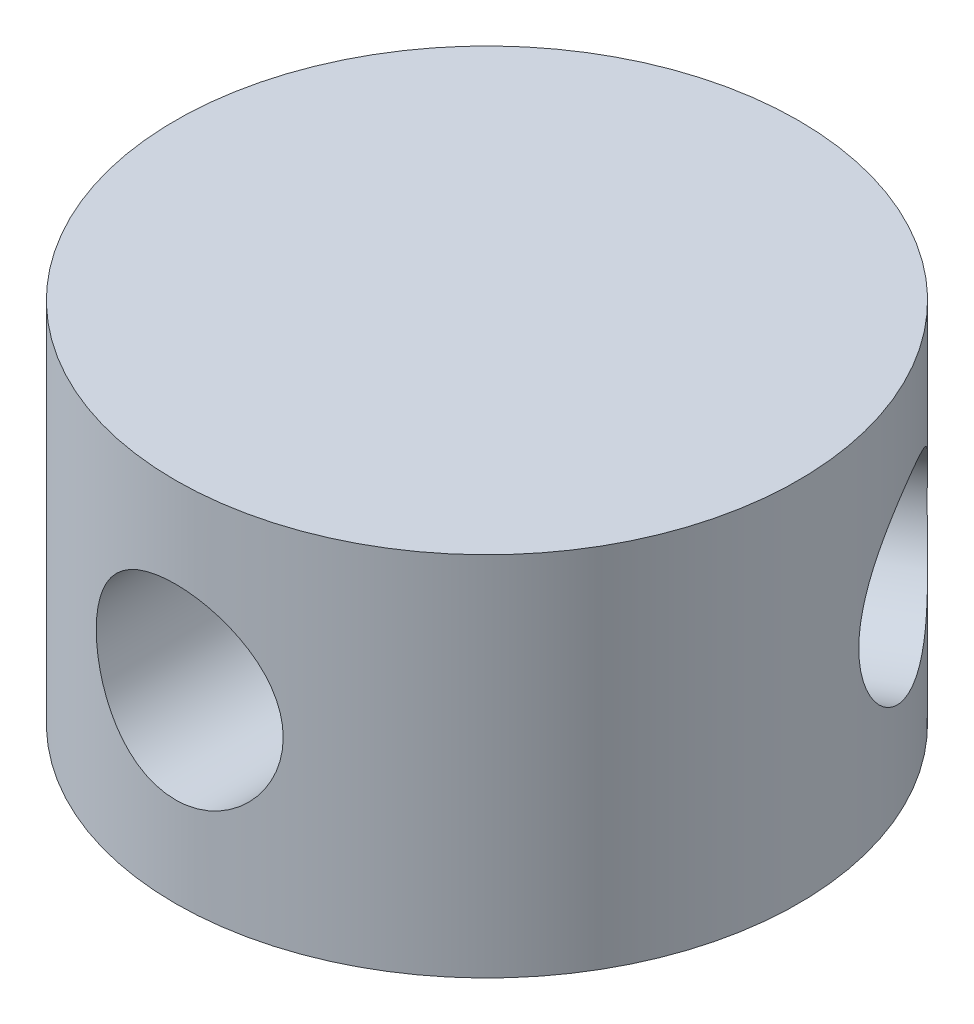
ISO-10303-21;
HEADER;
FILE_DESCRIPTION(('STEP AP214'),'2;1');
FILE_NAME('part.step','',(''),(''),'','','');
FILE_SCHEMA(('AUTOMOTIVE_DESIGN { 1 0 10303 214 1 1 1 1 }'));
ENDSEC;
DATA;
#1=APPLICATION_CONTEXT('core data for automotive mechanical design processes');
#2=APPLICATION_PROTOCOL_DEFINITION('international standard','automotive_design',2000,#1);
#3=PRODUCT_CONTEXT('',#1,'mechanical');
#4=PRODUCT('Part','Part','',(#3));
#5=PRODUCT_RELATED_PRODUCT_CATEGORY('part','',(#4));
#6=PRODUCT_DEFINITION_FORMATION('','',#4);
#7=PRODUCT_DEFINITION_CONTEXT('part definition',#1,'design');
#8=PRODUCT_DEFINITION('design','',#6,#7);
#9=PRODUCT_DEFINITION_SHAPE('','',#8);
#10=(LENGTH_UNIT() NAMED_UNIT(*) SI_UNIT(.MILLI.,.METRE.));
#11=(NAMED_UNIT(*) PLANE_ANGLE_UNIT() SI_UNIT($,.RADIAN.));
#12=(NAMED_UNIT(*) SI_UNIT($,.STERADIAN.) SOLID_ANGLE_UNIT());
#13=UNCERTAINTY_MEASURE_WITH_UNIT(LENGTH_MEASURE(1.E-05),#10,'distance_accuracy_value','');
#14=(GEOMETRIC_REPRESENTATION_CONTEXT(3) GLOBAL_UNCERTAINTY_ASSIGNED_CONTEXT((#13)) GLOBAL_UNIT_ASSIGNED_CONTEXT((#10,
#11,#12)) REPRESENTATION_CONTEXT('',''));
#15=CARTESIAN_POINT('',(0.,0.,0.));
#16=DIRECTION('',(0.,0.,1.));
#17=DIRECTION('',(1.,0.,0.));
#18=AXIS2_PLACEMENT_3D('',#15,#16,#17);
#19=CARTESIAN_POINT('',(0.,20.,0.));
#20=DIRECTION('',(0.,-1.,0.));
#21=DIRECTION('',(0.,0.,-1.));
#22=AXIS2_PLACEMENT_3D('',#19,#20,#21);
#23=CYLINDRICAL_SURFACE('',#22,17.);
#24=CARTESIAN_POINT('',(11.4943048955795,10.,-12.5252127713447));
#25=CARTESIAN_POINT('',(11.4943091391889,9.72053853699297,-12.5252112025164));
#26=CARTESIAN_POINT('',(11.5121535043202,9.44104263790955,-12.5089037602181));
#27=CARTESIAN_POINT('',(11.582323652573,8.89022215138816,-12.4439542886179));
#28=CARTESIAN_POINT('',(11.6346609568794,8.61890032589522,-12.3953014553984));
#29=CARTESIAN_POINT('',(11.7703119951408,8.09248192387591,-12.266556572506));
#30=CARTESIAN_POINT('',(11.8535742009086,7.83735917924745,-12.1865168085596));
#31=CARTESIAN_POINT('',(12.046230903556,7.34928542441603,-11.996107448568));
#32=CARTESIAN_POINT('',(12.1556293122564,7.11633774047292,-11.8857333119874));
#33=CARTESIAN_POINT('',(12.3983275906579,6.67185427203691,-11.6324133127298));
#34=CARTESIAN_POINT('',(12.5322228461527,6.46112394698262,-11.4886242638794));
#35=CARTESIAN_POINT('',(12.815100635476,6.07423096550347,-11.1722052069468));
#36=CARTESIAN_POINT('',(12.9640851049248,5.89807275247041,-10.9995714968672));
#37=CARTESIAN_POINT('',(13.2735846955966,5.58182682056676,-10.6241355000564));
#38=CARTESIAN_POINT('',(13.4342745533065,5.44256035689445,-10.4207831661269));
#39=CARTESIAN_POINT('',(13.757182796132,5.20944331925463,-9.99060207069339));
#40=CARTESIAN_POINT('',(13.9194008438892,5.11558295048468,-9.7637783851526));
#41=CARTESIAN_POINT('',(14.2339950457867,4.97860799629227,-9.29891731425782));
#42=CARTESIAN_POINT('',(14.3865199937958,4.93411856598081,-9.06138632775509));
#43=CARTESIAN_POINT('',(14.6810757235563,4.89280109620211,-8.57592863912629));
#44=CARTESIAN_POINT('',(14.8231087031818,4.89596304603335,-8.32800413140644));
#45=CARTESIAN_POINT('',(15.0881298736171,4.94893575304626,-7.83732552729773));
#46=CARTESIAN_POINT('',(15.2115805337236,4.99725765895348,-7.59465822612114));
#47=CARTESIAN_POINT('',(15.4422263749425,5.13674654238066,-7.11398284027728));
#48=CARTESIAN_POINT('',(15.5494205260546,5.22791623320535,-6.87597505166461));
#49=CARTESIAN_POINT('',(15.7476518826786,5.45152087962283,-6.40910186640061));
#50=CARTESIAN_POINT('',(15.8384863646027,5.58442408954371,-6.18037523951549));
#51=CARTESIAN_POINT('',(16.0026345620649,5.88735269825698,-5.74199944763631));
#52=CARTESIAN_POINT('',(16.075944112242,6.0573869040796,-5.53235482540923));
#53=CARTESIAN_POINT('',(16.2085898798231,6.43747235255154,-5.13108424221061));
#54=CARTESIAN_POINT('',(16.2672785082069,6.64881352468632,-4.94046440445144));
#55=CARTESIAN_POINT('',(16.3685948428311,7.10153406084096,-4.5936727163767));
#56=CARTESIAN_POINT('',(16.4112209532096,7.34291640637865,-4.43750428955632));
#57=CARTESIAN_POINT('',(16.4826112226964,7.85201419540269,-4.16457733711507));
#58=CARTESIAN_POINT('',(16.5112385376736,8.11995995574973,-4.04821107964877));
#59=CARTESIAN_POINT('',(16.5556782401713,8.67266450852361,-3.86247882302972));
#60=CARTESIAN_POINT('',(16.5714948085423,8.95741778315959,-3.79309749132657));
#61=CARTESIAN_POINT('',(16.5910583743358,9.52428002655414,-3.70657371426142));
#62=CARTESIAN_POINT('',(16.59523326391,9.8060919612504,-3.68758057334801));
#63=CARTESIAN_POINT('',(16.5930351099663,10.3688078600227,-3.69746122350779));
#64=CARTESIAN_POINT('',(16.5866635429618,10.649711945682,-3.72632831410652));
#65=CARTESIAN_POINT('',(16.5632399278289,11.1950604851038,-3.82906088886021));
#66=CARTESIAN_POINT('',(16.5464696445532,11.4597429584967,-3.90173789226828));
#67=CARTESIAN_POINT('',(16.5014964165414,11.97336574877,-4.08775140933676));
#68=CARTESIAN_POINT('',(16.4732917065157,12.2223036280777,-4.20109420082303));
#69=CARTESIAN_POINT('',(16.403105234614,12.7047593778455,-4.46738511332275));
#70=CARTESIAN_POINT('',(16.3607740180636,12.9376840513517,-4.62131458230898));
#71=CARTESIAN_POINT('',(16.2608526581479,13.3749695610147,-4.96145500568997));
#72=CARTESIAN_POINT('',(16.2032588611629,13.5793235398835,-5.147673685915));
#73=CARTESIAN_POINT('',(16.0687310107979,13.9616133797701,-5.55366855741561));
#74=CARTESIAN_POINT('',(15.991149080423,14.1382611385557,-5.77444598558341));
#75=CARTESIAN_POINT('',(15.8166685958073,14.4504867834944,-6.23649630449087));
#76=CARTESIAN_POINT('',(15.7197710012639,14.586066709257,-6.47776817662381));
#77=CARTESIAN_POINT('',(15.5073858628341,14.8110001039322,-6.97082578529305));
#78=CARTESIAN_POINT('',(15.3920460137217,14.9006988549405,-7.22251710469358));
#79=CARTESIAN_POINT('',(15.1437121781149,15.0322071242274,-7.72965570488983));
#80=CARTESIAN_POINT('',(15.0107232548554,15.0740303442246,-7.98510188985502));
#81=CARTESIAN_POINT('',(14.7356999073447,15.1075583497853,-8.48154407292581));
#82=CARTESIAN_POINT('',(14.5942110476232,15.1011311643867,-8.72271771670226));
#83=CARTESIAN_POINT('',(14.3021457670378,15.0428064495029,-9.19377085785793));
#84=CARTESIAN_POINT('',(14.1515698618854,14.9909114981663,-9.42365099482983));
#85=CARTESIAN_POINT('',(13.8483022354747,14.8442803512415,-9.8638363779501));
#86=CARTESIAN_POINT('',(13.6956505980359,14.7500101857942,-10.0743253187337));
#87=CARTESIAN_POINT('',(13.392374428475,14.5217214906747,-10.4741271825936));
#88=CARTESIAN_POINT('',(13.2417502337292,14.3876964290238,-10.6634366186995));
#89=CARTESIAN_POINT('',(12.9437875378919,14.0787302447412,-11.0233720182528));
#90=CARTESIAN_POINT('',(12.7967083829254,13.9026171380099,-11.1932063417015));
#91=CARTESIAN_POINT('',(12.5175726784085,13.516584679656,-11.5045286642304));
#92=CARTESIAN_POINT('',(12.385520474445,13.3066555910995,-11.6460084725343));
#93=CARTESIAN_POINT('',(12.1392442729903,12.8514413537876,-11.9025784357291));
#94=CARTESIAN_POINT('',(12.025668937567,12.6052889186445,-12.0167563849168));
#95=CARTESIAN_POINT('',(11.8278644036053,12.089112408027,-12.2115111351694));
#96=CARTESIAN_POINT('',(11.7436211060987,11.8190998798043,-12.2921040831426));
#97=CARTESIAN_POINT('',(11.6171088445098,11.2928825325027,-12.4116687818066));
#98=CARTESIAN_POINT('',(11.5712921039912,11.038330600425,-12.4541926960258));
#99=CARTESIAN_POINT('',(11.5098911761672,10.522528243524,-12.5109625896933));
#100=CARTESIAN_POINT('',(11.4943009280674,10.2612791722088,-12.5252142381021));
#101=CARTESIAN_POINT('',(11.4943048955795,10.,-12.5252127713447));
#102=B_SPLINE_CURVE_WITH_KNOTS('',3,(#24,#25,#26,#27,#28,#29,#30,#31,#32,#33,#34,#35,#36,#37,
#38,#39,#40,#41,#42,#43,#44,#45,#46,#47,#48,#49,#50,#51,#52,#53,#54,#55,#56,#57,#58,#59,#60,#61,
#62,#63,#64,#65,#66,#67,#68,#69,#70,#71,#72,#73,#74,#75,#76,#77,#78,#79,#80,#81,#82,#83,#84,#85,
#86,#87,#88,#89,#90,#91,#92,#93,#94,#95,#96,#97,#98,#99,#100,#101),.UNSPECIFIED.,.T.,.F.,(4,2,2,
2,2,2,2,2,2,2,2,2,2,2,2,2,2,2,2,2,2,2,2,2,2,2,2,2,2,2,2,2,2,2,2,2,2,2,4),(0.,0.837420564112846,
1.6751209817426,2.51143180918506,3.34786788625834,4.20828710027145,5.06881682762327,
5.94714193530391,6.82527748998782,7.67829276508496,8.53112883944897,9.35680428368992,
10.1825320202728,11.017877117413,11.8534205640882,12.7211729987914,13.5890116247233,
14.4651721004139,15.3410465214545,16.1842747469591,17.0273849297397,17.8485922280083,
18.6699263556453,19.5133048816078,20.3568854816719,21.232303207509,22.1076774491114,
22.9763633217756,23.8448005190257,24.67979433307,25.5147408037122,26.340721293744,
27.1668375727954,28.0193873199412,28.8721829895048,29.7503957488581,30.6281857949063,
31.4112792312854,32.1942156312732),.UNSPECIFIED.);
#103=CARTESIAN_POINT('',(11.4943048955795,10.,-12.5252127713447));
#104=VERTEX_POINT('',#103);
#105=EDGE_CURVE('E10',#104,#104,#102,.T.);
#106=ORIENTED_EDGE('',*,*,#105,.T.);
#107=EDGE_LOOP('',(#106));
#108=FACE_BOUND('',#107,.T.);
#109=CARTESIAN_POINT('',(-16.5943048955796,10.,-3.69175365274325));
#110=CARTESIAN_POINT('',(-16.5943056587391,9.72053853699297,-3.6917581122309));
#111=CARTESIAN_POINT('',(-16.5891051820037,9.44104263790955,-3.71536550689819));
#112=CARTESIAN_POINT('',(-16.5679423637619,8.89022215138816,-3.8086093736725));
#113=CARTESIAN_POINT('',(-16.551976426381,8.61890032589522,-3.87826122537722));
#114=CARTESIAN_POINT('',(-16.5083056063196,8.09248192387591,-4.06011091200761));
#115=CARTESIAN_POINT('',(-16.480620240313,7.83735917924745,-4.17223797935077));
#116=CARTESIAN_POINT('',(-16.4120492487656,7.34928542441603,-4.43428825804859));
#117=CARTESIAN_POINT('',(-16.3711616469163,7.11633774047293,-4.58421712740701));
#118=CARTESIAN_POINT('',(-16.2731292314733,6.67185427203691,-4.92106000158624));
#119=CARTESIAN_POINT('',(-16.2155518901302,6.46112394698262,-5.10891121871617));
#120=CARTESIAN_POINT('',(-16.0829638432467,6.07423096550347,-5.51210009890282));
#121=CARTESIAN_POINT('',(-16.0079508994927,5.89807275247041,-5.72744128925463));
#122=CARTESIAN_POINT('',(-15.8375635840953,5.58182682056676,-6.18319379564274));
#123=CARTESIAN_POINT('',(-15.7418002258484,5.44256035689445,-6.42403146151478));
#124=CARTESIAN_POINT('',(-15.5307065903879,5.20944331925463,-6.9187687506098));
#125=CARTESIAN_POINT('',(-15.4153805404082,5.11558295048467,-7.17266554369019));
#126=CARTESIAN_POINT('',(-15.1700961447316,4.97860799629227,-7.67754264986412));
#127=CARTESIAN_POINT('',(-15.0406507502388,4.93411856598081,-7.92839862280228));
#128=CARTESIAN_POINT('',(-14.767509924304,4.89280109620211,-8.42622021191952));
#129=CARTESIAN_POINT('',(-14.6238174922107,4.89596304603335,-8.6731866343104));
#130=CARTESIAN_POINT('',(-14.3313879411767,4.94893575304626,-9.14804100250239));
#131=CARTESIAN_POINT('',(-14.1829572237432,4.99725765895349,-9.37628606085688));
#132=CARTESIAN_POINT('',(-13.882003049238,5.13674654238066,-9.81636891155159));
#133=CARTESIAN_POINT('',(-13.7294793335569,5.22791623320535,-10.0282056638581));
#134=CARTESIAN_POINT('',(-13.4242709730846,5.45152087962283,-10.4333156471532));
#135=CARTESIAN_POINT('',(-13.2716051446422,5.58442408954371,-10.6263439294816));
#136=CARTESIAN_POINT('',(-12.9740346712018,5.88735269825698,-10.9876883344089));
#137=CARTESIAN_POINT('',(-12.8291318776749,6.05738690407959,-11.1559985783158));
#138=CARTESIAN_POINT('',(-12.547944242624,6.43747235255154,-11.4715084743448));
#139=CARTESIAN_POINT('',(-12.4122069348512,6.64881352468632,-11.6176442363181));
#140=CARTESIAN_POINT('',(-12.1625346904693,7.10153406084096,-11.8787825999583));
#141=CARTESIAN_POINT('',(-12.048601920763,7.34291640637865,-11.9937821078208));
#142=CARTESIAN_POINT('',(-11.8479353813149,7.85201419540269,-12.192071371));
#143=CARTESIAN_POINT('',(-11.7614729036943,8.11995995574973,-12.2750464817455));
#144=CARTESIAN_POINT('',(-11.6228439024089,8.67266450852362,-12.4063985213547));
#145=CARTESIAN_POINT('',(-11.5706661907911,8.9574177831596,-12.4547867372163));
#146=CARTESIAN_POINT('',(-11.505516184718,9.52428002655414,-12.5149911707146));
#147=CARTESIAN_POINT('',(-11.4911550869764,9.8060919612504,-12.5281033016006));
#148=CARTESIAN_POINT('',(-11.4986129040488,10.3688078600227,-12.521259319364));
#149=CARTESIAN_POINT('',(-11.5204267543385,10.649711945682,-12.5013078351768));
#150=CARTESIAN_POINT('',(-11.5976839663049,11.1950604851038,-12.4296561020464));
#151=CARTESIAN_POINT('',(-11.6522389558893,11.4597429584967,-12.3787941089969));
#152=CARTESIAN_POINT('',(-11.790844773112,11.97336574877,-12.2468393925143));
#153=CARTESIAN_POINT('',(-11.8749001548621,12.2223036280777,-12.1657420013825));
#154=CARTESIAN_POINT('',(-12.070421613933,12.7047593778455,-11.9718132774638));
#155=CARTESIAN_POINT('',(-12.1825628361909,12.9376840513517,-11.8581886340649));
#156=CARTESIAN_POINT('',(-12.427172403735,13.3749695610147,-11.6015839863068));
#157=CARTESIAN_POINT('',(-12.5596456129766,13.5793235398835,-11.4585969549049));
#158=CARTESIAN_POINT('',(-12.8439835603198,13.9616133797701,-11.1390949832219));
#159=CARTESIAN_POINT('',(-12.9963914565079,14.1382611385557,-10.9615183465587));
#160=CARTESIAN_POINT('',(-13.3092985282005,14.4504867834944,-10.5793886549631));
#161=CARTESIAN_POINT('',(-13.4697973014146,14.586066709257,-10.3748369404565));
#162=CARTESIAN_POINT('',(-13.7906051468365,14.8110001039322,-9.94437721085544));
#163=CARTESIAN_POINT('',(-13.9509062987932,14.9006988549405,-9.71864431175515));
#164=CARTESIAN_POINT('',(-14.2659342919994,15.0322071242274,-9.25001160140225));
#165=CARTESIAN_POINT('',(-14.4206627158493,15.0740303442246,-9.007116722955));
#166=CARTESIAN_POINT('',(-14.7130825841435,15.1075583497853,-8.52071842584154));
#167=CARTESIAN_POINT('',(-14.8512006565164,15.1011311643867,-8.27759865708203));
#168=CARTESIAN_POINT('',(-15.113112002997,15.0428064495029,-7.78913613395382));
#169=CARTESIAN_POINT('',(-15.2369060888638,14.9909114981663,-7.54379350640798));
#170=CARTESIAN_POINT('',(-15.4664839998152,14.8442803512415,-7.06106334623079));
#171=CARTESIAN_POINT('',(-15.5724469510301,14.7500101857942,-6.82361867988773));
#172=CARTESIAN_POINT('',(-15.7670474368327,14.5217214906747,-6.36107288075556));
#173=CARTESIAN_POINT('',(-15.8556821203036,14.3876964290238,-6.13597378362818));
#174=CARTESIAN_POINT('',(-16.0184139721195,14.0787302447412,-5.6979628198763));
#175=CARTESIAN_POINT('',(-16.0919552331773,13.9026171380099,-5.48567137358382));
#176=CARTESIAN_POINT('',(-16.222000420994,13.516584679656,-5.08827160110455));
#177=CARTESIAN_POINT('',(-16.278499427126,13.3066555910995,-4.90317113369443));
#178=CARTESIAN_POINT('',(-16.3775574323734,12.8514413537876,-4.56160470528978));
#179=CARTESIAN_POINT('',(-16.4196507692104,12.6052889186445,-4.40615660497598));
#180=CARTESIAN_POINT('',(-16.4894110634559,12.089112408027,-4.13747547845514));
#181=CARTESIAN_POINT('',(-16.5170849550133,11.8190998798043,-4.02422216872923));
#182=CARTESIAN_POINT('',(-16.5573748906577,11.2928825325027,-3.854876986971));
#183=CARTESIAN_POINT('',(-16.5712933103805,11.038330600425,-3.7939365686537));
#184=CARTESIAN_POINT('',(-16.5897570165548,10.522528243524,-3.71237685850837));
#185=CARTESIAN_POINT('',(-16.5943041820727,10.2612791722088,-3.69174948339829));
#186=CARTESIAN_POINT('',(-16.5943048955796,10.,-3.69175365274325));
#187=B_SPLINE_CURVE_WITH_KNOTS('',3,(#109,#110,#111,#112,#113,#114,#115,#116,#117,#118,#119,
#120,#121,#122,#123,#124,#125,#126,#127,#128,#129,#130,#131,#132,#133,#134,#135,#136,#137,#138,
#139,#140,#141,#142,#143,#144,#145,#146,#147,#148,#149,#150,#151,#152,#153,#154,#155,#156,#157,
#158,#159,#160,#161,#162,#163,#164,#165,#166,#167,#168,#169,#170,#171,#172,#173,#174,#175,#176,
#177,#178,#179,#180,#181,#182,#183,#184,#185,#186),.UNSPECIFIED.,.T.,.F.,(4,2,2,2,2,2,2,2,2,2,2,
2,2,2,2,2,2,2,2,2,2,2,2,2,2,2,2,2,2,2,2,2,2,2,2,2,2,2,4),(0.,0.837420564112844,1.6751209817426,
2.51143180918506,3.34786788625834,4.20828710027145,5.06881682762327,5.94714193530391,
6.82527748998781,7.67829276508496,8.53112883944897,9.35680428368992,10.1825320202728,
11.017877117413,11.8534205640882,12.7211729987914,13.5890116247233,14.4651721004139,
15.3410465214545,16.1842747469591,17.0273849297397,17.8485922280083,18.6699263556453,
19.5133048816078,20.3568854816719,21.232303207509,22.1076774491114,22.9763633217756,
23.8448005190257,24.67979433307,25.5147408037122,26.340721293744,27.1668375727954,
28.0193873199412,28.8721829895048,29.7503957488581,30.6281857949063,31.4112792312854,
32.1942156312733),.UNSPECIFIED.);
#188=CARTESIAN_POINT('',(-16.5943048955796,10.,-3.69175365274325));
#189=VERTEX_POINT('',#188);
#190=EDGE_CURVE('E41',#189,#189,#187,.T.);
#191=ORIENTED_EDGE('',*,*,#190,.T.);
#192=EDGE_LOOP('',(#191));
#193=FACE_BOUND('',#192,.T.);
#194=CARTESIAN_POINT('',(5.1,10.,16.2169664240881));
#195=CARTESIAN_POINT('',(5.09999651955016,9.72053853699297,16.2169693147474));
#196=CARTESIAN_POINT('',(5.07695167768342,9.44104263790955,16.2242692671164));
#197=CARTESIAN_POINT('',(4.98561871118889,8.89022215138816,16.2525636622905));
#198=CARTESIAN_POINT('',(4.91731546950149,8.61890032589522,16.2735626807757));
#199=CARTESIAN_POINT('',(4.73799361117864,8.09248192387591,16.3266674845137));
#200=CARTESIAN_POINT('',(4.62704603940432,7.83735917924745,16.3587547879105));
#201=CARTESIAN_POINT('',(4.36581834520955,7.34928542441603,16.4303957066167));
#202=CARTESIAN_POINT('',(4.21553233465978,7.11633774047293,16.4699504393945));
#203=CARTESIAN_POINT('',(3.87480164081533,6.67185427203691,16.5534733143162));
#204=CARTESIAN_POINT('',(3.68332904397743,6.46112394698262,16.5975354825957));
#205=CARTESIAN_POINT('',(3.26786320777063,6.07423096550347,16.6843053058497));
#206=CARTESIAN_POINT('',(3.04386579456778,5.89807275247041,16.727012786122));
#207=CARTESIAN_POINT('',(2.56397888849855,5.58182682056676,16.8073292956992));
#208=CARTESIAN_POINT('',(2.30752567254177,5.44256035689445,16.8448146276417));
#209=CARTESIAN_POINT('',(1.7735237942558,5.20944331925463,16.9093708213033));
#210=CARTESIAN_POINT('',(1.4959796965189,5.11558295048467,16.9364439288429));
#211=CARTESIAN_POINT('',(0.936101098944822,4.97860799629227,16.976459964122));
#212=CARTESIAN_POINT('',(0.654130756442926,4.93411856598081,16.9897849505574));
#213=CARTESIAN_POINT('',(0.0864342007476682,4.89280109620211,17.0021488510459));
#214=CARTESIAN_POINT('',(-0.199291210971263,4.89596304603335,17.0011907657169));
#215=CARTESIAN_POINT('',(-0.756741932440534,4.94893575304626,16.9853665298002));
#216=CARTESIAN_POINT('',(-1.02862330998052,4.99725765895348,16.9709442869781));
#217=CARTESIAN_POINT('',(-1.56022332570463,5.13674654238066,16.9303517518289));
#218=CARTESIAN_POINT('',(-1.81994119249782,5.22791623320535,16.9041807155228));
#219=CARTESIAN_POINT('',(-2.32338090959421,5.45152087962283,16.8424175135539));
#220=CARTESIAN_POINT('',(-2.56688121996069,5.58442408954371,16.8067191689971));
#221=CARTESIAN_POINT('',(-3.02859989086327,5.88735269825698,16.7296877820452));
#222=CARTESIAN_POINT('',(-3.24681223456726,6.0573869040796,16.688353403725));
#223=CARTESIAN_POINT('',(-3.66064563719922,6.43747235255154,16.6025927165555));
#224=CARTESIAN_POINT('',(-3.85507157335584,6.64881352468632,16.5581086407696));
#225=CARTESIAN_POINT('',(-4.20606015236195,7.10153406084096,16.472455316335));
#226=CARTESIAN_POINT('',(-4.36261903244668,7.34291640637865,16.4312863973771));
#227=CARTESIAN_POINT('',(-4.63467584138169,7.85201419540269,16.3566487081151));
#228=CARTESIAN_POINT('',(-4.74976563397942,8.11995995574973,16.3232575613943));
#229=CARTESIAN_POINT('',(-4.93283433776257,8.67266450852361,16.2688773443844));
#230=CARTESIAN_POINT('',(-5.0008286177514,8.95741778315959,16.2478842285429));
#231=CARTESIAN_POINT('',(-5.08554218961796,9.52428002655414,16.2215648849761));
#232=CARTESIAN_POINT('',(-5.10407817693372,9.8060919612504,16.2156838749486));
#233=CARTESIAN_POINT('',(-5.0944222059176,10.3688078600227,16.2187205428718));
#234=CARTESIAN_POINT('',(-5.0662367886235,10.649711945682,16.2276361492834));
#235=CARTESIAN_POINT('',(-4.96555596152414,11.1950604851038,16.2587169909066));
#236=CARTESIAN_POINT('',(-4.89423068866398,11.4597429584967,16.2805320012652));
#237=CARTESIAN_POINT('',(-4.71065164342951,11.97336574877,16.3345908018511));
#238=CARTESIAN_POINT('',(-4.5983915516537,12.2223036280777,16.3668362022056));
#239=CARTESIAN_POINT('',(-4.33268362068114,12.7047593778455,16.4391983907866));
#240=CARTESIAN_POINT('',(-4.17821118187282,12.9376840513517,16.4795032163739));
#241=CARTESIAN_POINT('',(-3.83368025441304,13.3749695610147,16.5630389919968));
#242=CARTESIAN_POINT('',(-3.64361324818647,13.5793235398835,16.6062706408199));
#243=CARTESIAN_POINT('',(-3.22474745047824,13.9616133797701,16.6927635406376));
#244=CARTESIAN_POINT('',(-2.99475762391528,14.1382611385557,16.7359643321422));
#245=CARTESIAN_POINT('',(-2.50737006760684,14.4504867834944,16.8158849594541));
#246=CARTESIAN_POINT('',(-2.24997369984941,14.586066709257,16.8526051170804));
#247=CARTESIAN_POINT('',(-1.71678071599776,14.8110001039322,16.9152029961486));
#248=CARTESIAN_POINT('',(-1.44113971492866,14.9006988549405,16.9411614164488));
#249=CARTESIAN_POINT('',(-0.877777886115598,15.0322071242274,16.9796673062921));
#250=CARTESIAN_POINT('',(-0.590060539006182,15.0740303442246,16.9922186128101));
#251=CARTESIAN_POINT('',(-0.0226173232013399,15.1075583497853,17.0022624987674));
#252=CARTESIAN_POINT('',(0.256989608893054,15.1011311643867,17.0003163737844));
#253=CARTESIAN_POINT('',(0.810966235959017,15.0428064495029,16.9829069918118));
#254=CARTESIAN_POINT('',(1.08533622697837,14.9909114981663,16.9674445012379));
#255=CARTESIAN_POINT('',(1.61818176434044,14.8442803512415,16.924899724181));
#256=CARTESIAN_POINT('',(1.8767963529941,14.7500101857942,16.8979439986215));
#257=CARTESIAN_POINT('',(2.37467300835761,14.5217214906747,16.8352000633492));
#258=CARTESIAN_POINT('',(2.61393188657432,14.3876964290238,16.7994104023277));
#259=CARTESIAN_POINT('',(3.07462643422749,14.0787302447412,16.7213348381292));
#260=CARTESIAN_POINT('',(3.29524685025182,13.9026171380099,16.6788777152854));
#261=CARTESIAN_POINT('',(3.7044277425854,13.516584679656,16.592800265335));
#262=CARTESIAN_POINT('',(3.89297895268092,13.3066555910995,16.5491796062288));
#263=CARTESIAN_POINT('',(4.23831315938298,12.8514413537876,16.464183141019));
#264=CARTESIAN_POINT('',(4.39398183164325,12.6052889186445,16.4229129898929));
#265=CARTESIAN_POINT('',(4.66154665985047,12.089112408027,16.3489866136246));
#266=CARTESIAN_POINT('',(4.77346384891446,11.8190998798043,16.3163262518719));
#267=CARTESIAN_POINT('',(4.94026604614778,11.2928825325027,16.2665457687777));
#268=CARTESIAN_POINT('',(5.00000120638926,11.038330600425,16.2481292646796));
#269=CARTESIAN_POINT('',(5.07986584038751,10.522528243524,16.2233394482018));
#270=CARTESIAN_POINT('',(5.1000032540052,10.2612791722088,16.2169637215005));
#271=CARTESIAN_POINT('',(5.1,10.,16.2169664240881));
#272=B_SPLINE_CURVE_WITH_KNOTS('',3,(#194,#195,#196,#197,#198,#199,#200,#201,#202,#203,#204,
#205,#206,#207,#208,#209,#210,#211,#212,#213,#214,#215,#216,#217,#218,#219,#220,#221,#222,#223,
#224,#225,#226,#227,#228,#229,#230,#231,#232,#233,#234,#235,#236,#237,#238,#239,#240,#241,#242,
#243,#244,#245,#246,#247,#248,#249,#250,#251,#252,#253,#254,#255,#256,#257,#258,#259,#260,#261,
#262,#263,#264,#265,#266,#267,#268,#269,#270,#271),.UNSPECIFIED.,.T.,.F.,(4,2,2,2,2,2,2,2,2,2,2,
2,2,2,2,2,2,2,2,2,2,2,2,2,2,2,2,2,2,2,2,2,2,2,2,2,2,2,4),(0.,0.837420564112844,1.6751209817426,
2.51143180918506,3.34786788625834,4.20828710027145,5.06881682762327,5.94714193530391,
6.82527748998782,7.67829276508496,8.53112883944897,9.35680428368992,10.1825320202728,
11.017877117413,11.8534205640882,12.7211729987914,13.5890116247233,14.4651721004139,
15.3410465214545,16.1842747469591,17.0273849297397,17.8485922280083,18.6699263556453,
19.5133048816078,20.3568854816719,21.232303207509,22.1076774491114,22.9763633217756,
23.8448005190257,24.67979433307,25.5147408037122,26.340721293744,27.1668375727954,
28.0193873199412,28.8721829895048,29.7503957488581,30.6281857949063,31.4112792312854,
32.1942156312732),.UNSPECIFIED.);
#273=CARTESIAN_POINT('',(5.1,10.,16.2169664240881));
#274=VERTEX_POINT('',#273);
#275=EDGE_CURVE('E45',#274,#274,#272,.T.);
#276=ORIENTED_EDGE('',*,*,#275,.T.);
#277=EDGE_LOOP('',(#276));
#278=FACE_BOUND('',#277,.T.);
#279=CARTESIAN_POINT('',(0.,20.,0.));
#280=DIRECTION('',(0.,1.,0.));
#281=DIRECTION('',(0.,0.,1.));
#282=AXIS2_PLACEMENT_3D('',#279,#280,#281);
#283=CIRCLE('',#282,17.);
#284=CARTESIAN_POINT('',(0.,20.,17.));
#285=VERTEX_POINT('',#284);
#286=EDGE_CURVE('E88',#285,#285,#283,.T.);
#287=ORIENTED_EDGE('',*,*,#286,.F.);
#288=EDGE_LOOP('',(#287));
#289=FACE_BOUND('',#288,.T.);
#290=CARTESIAN_POINT('',(0.,0.,0.));
#291=DIRECTION('',(0.,1.,0.));
#292=DIRECTION('',(0.,0.,1.));
#293=AXIS2_PLACEMENT_3D('',#290,#291,#292);
#294=CIRCLE('',#293,17.);
#295=CARTESIAN_POINT('',(0.,0.,17.));
#296=VERTEX_POINT('',#295);
#297=EDGE_CURVE('E89',#296,#296,#294,.T.);
#298=ORIENTED_EDGE('',*,*,#297,.T.);
#299=EDGE_LOOP('',(#298));
#300=FACE_BOUND('',#299,.T.);
#301=ADVANCED_FACE('F33',(#108,#193,#278,#289,#300),#23,.T.);
#302=CARTESIAN_POINT('',(0.,20.,0.));
#303=DIRECTION('',(0.,1.,0.));
#304=DIRECTION('',(0.,0.,1.));
#305=AXIS2_PLACEMENT_3D('',#302,#303,#304);
#306=PLANE('',#305);
#307=ORIENTED_EDGE('',*,*,#286,.T.);
#308=EDGE_LOOP('',(#307));
#309=FACE_BOUND('',#308,.T.);
#310=ADVANCED_FACE('F82',(#309),#306,.T.);
#311=CARTESIAN_POINT('',(0.,0.,0.));
#312=DIRECTION('',(0.,1.,0.));
#313=DIRECTION('',(0.,0.,1.));
#314=AXIS2_PLACEMENT_3D('',#311,#312,#313);
#315=PLANE('',#314);
#316=CARTESIAN_POINT('',(0.,0.,0.));
#317=DIRECTION('',(0.,-1.,0.));
#318=DIRECTION('',(0.,0.,-1.));
#319=AXIS2_PLACEMENT_3D('',#316,#317,#318);
#320=CIRCLE('',#319,13.5);
#321=CARTESIAN_POINT('',(0.,0.,-13.5));
#322=VERTEX_POINT('',#321);
#323=EDGE_CURVE('E104',#322,#322,#320,.T.);
#324=ORIENTED_EDGE('',*,*,#323,.F.);
#325=EDGE_LOOP('',(#324));
#326=FACE_BOUND('',#325,.T.);
#327=ORIENTED_EDGE('',*,*,#297,.F.);
#328=EDGE_LOOP('',(#327));
#329=FACE_BOUND('',#328,.T.);
#330=ADVANCED_FACE('F80',(#326,#329),#315,.F.);
#331=CARTESIAN_POINT('',(0.,10.,7.));
#332=DIRECTION('',(0.,0.,1.));
#333=DIRECTION('',(1.,0.,0.));
#334=AXIS2_PLACEMENT_3D('',#331,#332,#333);
#335=CYLINDRICAL_SURFACE('',#334,5.1);
#336=CARTESIAN_POINT('',(0.,10.,7.));
#337=DIRECTION('',(0.,0.,1.));
#338=DIRECTION('',(1.,0.,0.));
#339=AXIS2_PLACEMENT_3D('',#336,#337,#338);
#340=CIRCLE('',#339,5.1);
#341=CARTESIAN_POINT('',(5.1,10.,7.));
#342=VERTEX_POINT('',#341);
#343=EDGE_CURVE('E92',#342,#342,#340,.T.);
#344=ORIENTED_EDGE('',*,*,#343,.F.);
#345=EDGE_LOOP('',(#344));
#346=FACE_BOUND('',#345,.T.);
#347=ORIENTED_EDGE('',*,*,#275,.F.);
#348=EDGE_LOOP('',(#347));
#349=FACE_BOUND('',#348,.T.);
#350=ADVANCED_FACE('F75',(#346,#349),#335,.F.);
#351=CARTESIAN_POINT('',(0.,10.,7.));
#352=DIRECTION('',(0.,0.,1.));
#353=DIRECTION('',(1.,0.,0.));
#354=AXIS2_PLACEMENT_3D('',#351,#352,#353);
#355=PLANE('',#354);
#356=ORIENTED_EDGE('',*,*,#343,.T.);
#357=EDGE_LOOP('',(#356));
#358=FACE_BOUND('',#357,.T.);
#359=ADVANCED_FACE('F71',(#358),#355,.T.);
#360=CARTESIAN_POINT('',(-6.0621778264911,10.,-3.49999999999994));
#361=DIRECTION('',(-0.866025403784443,0.,-0.499999999999992));
#362=DIRECTION('',(-0.499999999999992,0.,0.866025403784443));
#363=AXIS2_PLACEMENT_3D('',#360,#361,#362);
#364=CYLINDRICAL_SURFACE('',#363,5.1);
#365=CARTESIAN_POINT('',(-6.0621778264911,10.,-3.49999999999994));
#366=DIRECTION('',(-0.866025403784443,0.,-0.499999999999992));
#367=DIRECTION('',(-0.499999999999992,0.,0.866025403784443));
#368=AXIS2_PLACEMENT_3D('',#365,#366,#367);
#369=CIRCLE('',#368,5.1);
#370=CARTESIAN_POINT('',(-8.61217782649106,10.,0.916729559300716));
#371=VERTEX_POINT('',#370);
#372=EDGE_CURVE('E98',#371,#371,#369,.T.);
#373=ORIENTED_EDGE('',*,*,#372,.F.);
#374=EDGE_LOOP('',(#373));
#375=FACE_BOUND('',#374,.T.);
#376=ORIENTED_EDGE('',*,*,#190,.F.);
#377=EDGE_LOOP('',(#376));
#378=FACE_BOUND('',#377,.T.);
#379=ADVANCED_FACE('F66',(#375,#378),#364,.F.);
#380=CARTESIAN_POINT('',(-6.0621778264911,10.,-3.49999999999994));
#381=DIRECTION('',(-0.866025403784443,0.,-0.499999999999992));
#382=DIRECTION('',(-0.499999999999992,0.,0.866025403784443));
#383=AXIS2_PLACEMENT_3D('',#380,#381,#382);
#384=PLANE('',#383);
#385=ORIENTED_EDGE('',*,*,#372,.T.);
#386=EDGE_LOOP('',(#385));
#387=FACE_BOUND('',#386,.T.);
#388=ADVANCED_FACE('F62',(#387),#384,.T.);
#389=CARTESIAN_POINT('',(6.06217782649106,10.,-3.50000000000003));
#390=DIRECTION('',(0.866025403784436,0.,-0.500000000000004));
#391=DIRECTION('',(-0.500000000000004,0.,-0.866025403784436));
#392=AXIS2_PLACEMENT_3D('',#389,#390,#391);
#393=CYLINDRICAL_SURFACE('',#392,5.1);
#394=CARTESIAN_POINT('',(6.06217782649106,10.,-3.50000000000003));
#395=DIRECTION('',(0.866025403784436,0.,-0.500000000000004));
#396=DIRECTION('',(-0.500000000000004,0.,-0.866025403784436));
#397=AXIS2_PLACEMENT_3D('',#394,#395,#396);
#398=CIRCLE('',#397,5.1);
#399=CARTESIAN_POINT('',(3.51217782649104,10.,-7.91672955930065));
#400=VERTEX_POINT('',#399);
#401=EDGE_CURVE('E97',#400,#400,#398,.T.);
#402=ORIENTED_EDGE('',*,*,#401,.F.);
#403=EDGE_LOOP('',(#402));
#404=FACE_BOUND('',#403,.T.);
#405=ORIENTED_EDGE('',*,*,#105,.F.);
#406=EDGE_LOOP('',(#405));
#407=FACE_BOUND('',#406,.T.);
#408=ADVANCED_FACE('F56',(#404,#407),#393,.F.);
#409=CARTESIAN_POINT('',(6.06217782649106,10.,-3.50000000000003));
#410=DIRECTION('',(0.866025403784436,0.,-0.500000000000004));
#411=DIRECTION('',(-0.500000000000004,0.,-0.866025403784436));
#412=AXIS2_PLACEMENT_3D('',#409,#410,#411);
#413=PLANE('',#412);
#414=ORIENTED_EDGE('',*,*,#401,.T.);
#415=EDGE_LOOP('',(#414));
#416=FACE_BOUND('',#415,.T.);
#417=ADVANCED_FACE('F61',(#416),#413,.T.);
#418=CARTESIAN_POINT('',(0.,3.,0.));
#419=DIRECTION('',(0.,-1.,0.));
#420=DIRECTION('',(0.,0.,-1.));
#421=AXIS2_PLACEMENT_3D('',#418,#419,#420);
#422=CYLINDRICAL_SURFACE('',#421,13.5);
#423=CARTESIAN_POINT('',(0.,3.,0.));
#424=DIRECTION('',(0.,-1.,0.));
#425=DIRECTION('',(0.,0.,-1.));
#426=AXIS2_PLACEMENT_3D('',#423,#424,#425);
#427=CIRCLE('',#426,13.5);
#428=CARTESIAN_POINT('',(0.,3.,-13.5));
#429=VERTEX_POINT('',#428);
#430=EDGE_CURVE('E101',#429,#429,#427,.T.);
#431=ORIENTED_EDGE('',*,*,#430,.F.);
#432=EDGE_LOOP('',(#431));
#433=FACE_BOUND('',#432,.T.);
#434=ORIENTED_EDGE('',*,*,#323,.T.);
#435=EDGE_LOOP('',(#434));
#436=FACE_BOUND('',#435,.T.);
#437=ADVANCED_FACE('F157',(#433,#436),#422,.F.);
#438=CARTESIAN_POINT('',(0.,3.,0.));
#439=DIRECTION('',(0.,-1.,0.));
#440=DIRECTION('',(0.,0.,-1.));
#441=AXIS2_PLACEMENT_3D('',#438,#439,#440);
#442=PLANE('',#441);
#443=CARTESIAN_POINT('',(0.,3.,0.));
#444=DIRECTION('',(0.,-1.,0.));
#445=DIRECTION('',(0.,0.,-1.));
#446=AXIS2_PLACEMENT_3D('',#443,#444,#445);
#447=CIRCLE('',#446,2.9);
#448=CARTESIAN_POINT('',(0.,3.,-2.9));
#449=VERTEX_POINT('',#448);
#450=EDGE_CURVE('E112',#449,#449,#447,.T.);
#451=ORIENTED_EDGE('',*,*,#450,.F.);
#452=EDGE_LOOP('',(#451));
#453=FACE_BOUND('',#452,.T.);
#454=ORIENTED_EDGE('',*,*,#430,.T.);
#455=EDGE_LOOP('',(#454));
#456=FACE_BOUND('',#455,.T.);
#457=ADVANCED_FACE('F159',(#453,#456),#442,.T.);
#458=CARTESIAN_POINT('',(0.,5.,0.));
#459=DIRECTION('',(0.,-1.,0.));
#460=DIRECTION('',(0.,0.,-1.));
#461=AXIS2_PLACEMENT_3D('',#458,#459,#460);
#462=PLANE('',#461);
#463=CARTESIAN_POINT('',(0.,5.,0.));
#464=DIRECTION('',(0.,-1.,0.));
#465=DIRECTION('',(0.,0.,-1.));
#466=AXIS2_PLACEMENT_3D('',#463,#464,#465);
#467=CIRCLE('',#466,2.9);
#468=CARTESIAN_POINT('',(0.,5.,-2.9));
#469=VERTEX_POINT('',#468);
#470=EDGE_CURVE('E115',#469,#469,#467,.T.);
#471=ORIENTED_EDGE('',*,*,#470,.T.);
#472=EDGE_LOOP('',(#471));
#473=FACE_BOUND('',#472,.T.);
#474=CARTESIAN_POINT('',(0.,5.,0.));
#475=DIRECTION('',(0.,-1.,0.));
#476=DIRECTION('',(0.,0.,-1.));
#477=AXIS2_PLACEMENT_3D('',#474,#475,#476);
#478=CIRCLE('',#477,1.9);
#479=CARTESIAN_POINT('',(0.,5.,-1.9));
#480=VERTEX_POINT('',#479);
#481=EDGE_CURVE('E37',#480,#480,#478,.F.);
#482=ORIENTED_EDGE('',*,*,#481,.T.);
#483=EDGE_LOOP('',(#482));
#484=FACE_BOUND('',#483,.T.);
#485=ADVANCED_FACE('F122',(#473,#484),#462,.T.);
#486=CARTESIAN_POINT('',(0.,5.,0.));
#487=DIRECTION('',(0.,-1.,0.));
#488=DIRECTION('',(0.,0.,-1.));
#489=AXIS2_PLACEMENT_3D('',#486,#487,#488);
#490=CYLINDRICAL_SURFACE('',#489,2.9);
#491=ORIENTED_EDGE('',*,*,#470,.F.);
#492=EDGE_LOOP('',(#491));
#493=FACE_BOUND('',#492,.T.);
#494=ORIENTED_EDGE('',*,*,#450,.T.);
#495=EDGE_LOOP('',(#494));
#496=FACE_BOUND('',#495,.T.);
#497=ADVANCED_FACE('F132',(#493,#496),#490,.F.);
#498=CARTESIAN_POINT('',(0.,11.,0.));
#499=DIRECTION('',(0.,-1.,0.));
#500=DIRECTION('',(0.,0.,-1.));
#501=AXIS2_PLACEMENT_3D('',#498,#499,#500);
#502=PLANE('',#501);
#503=CARTESIAN_POINT('',(0.,11.,0.));
#504=DIRECTION('',(0.,-1.,0.));
#505=DIRECTION('',(0.,0.,-1.));
#506=AXIS2_PLACEMENT_3D('',#503,#504,#505);
#507=CIRCLE('',#506,1.9);
#508=CARTESIAN_POINT('',(0.,11.,-1.9));
#509=VERTEX_POINT('',#508);
#510=EDGE_CURVE('E107',#509,#509,#507,.T.);
#511=ORIENTED_EDGE('',*,*,#510,.T.);
#512=EDGE_LOOP('',(#511));
#513=FACE_BOUND('',#512,.T.);
#514=ADVANCED_FACE('F126',(#513),#502,.T.);
#515=CARTESIAN_POINT('',(0.,11.,0.));
#516=DIRECTION('',(0.,-1.,0.));
#517=DIRECTION('',(0.,0.,-1.));
#518=AXIS2_PLACEMENT_3D('',#515,#516,#517);
#519=CYLINDRICAL_SURFACE('',#518,1.9);
#520=ORIENTED_EDGE('',*,*,#510,.F.);
#521=EDGE_LOOP('',(#520));
#522=FACE_BOUND('',#521,.T.);
#523=ORIENTED_EDGE('',*,*,#481,.F.);
#524=EDGE_LOOP('',(#523));
#525=FACE_BOUND('',#524,.T.);
#526=ADVANCED_FACE('F124',(#522,#525),#519,.F.);
#527=CLOSED_SHELL('',(#301,#310,#330,#350,#359,#379,#388,#408,#417,#437,#457,#485,#497,#514,#526));
#528=MANIFOLD_SOLID_BREP('B2',#527);
#529=ADVANCED_BREP_SHAPE_REPRESENTATION('',(#18,#528),#14);
#530=SHAPE_DEFINITION_REPRESENTATION(#9,#529);
ENDSEC;
END-ISO-10303-21;
